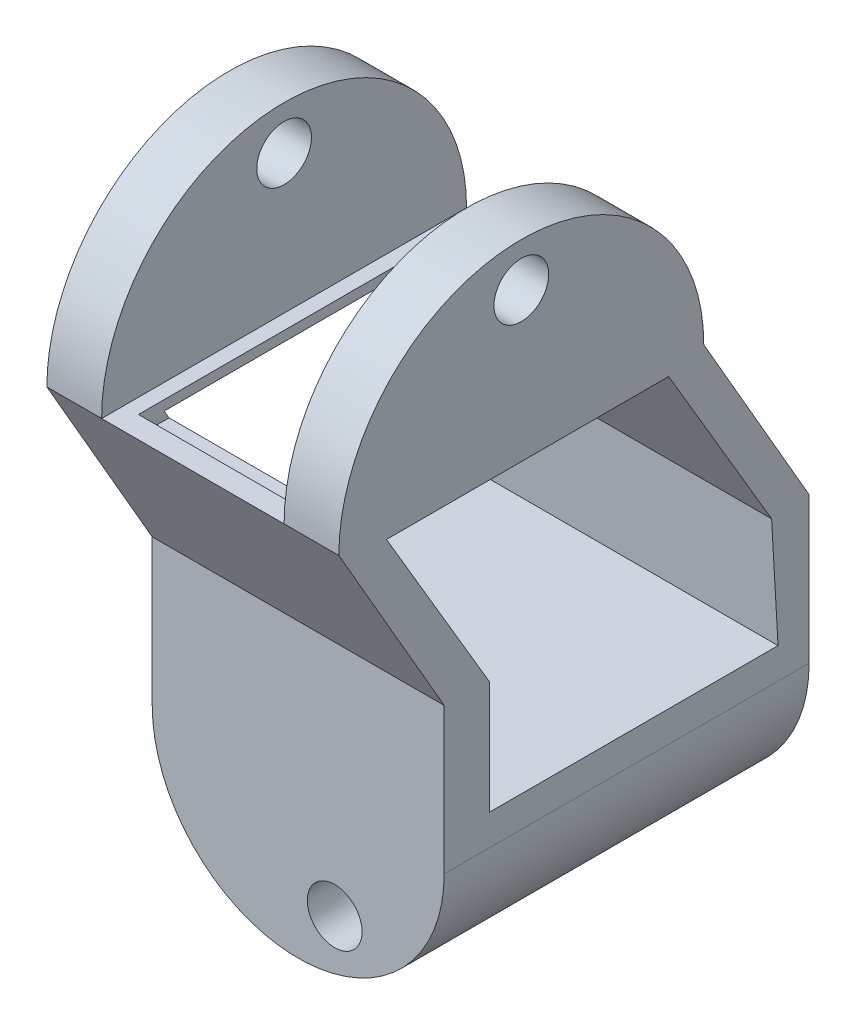
ISO-10303-21;
HEADER;
FILE_DESCRIPTION(('STEP AP214'),'2;1');
FILE_NAME('part.step','',(''),(''),'','','');
FILE_SCHEMA(('AUTOMOTIVE_DESIGN { 1 0 10303 214 1 1 1 1 }'));
ENDSEC;
DATA;
#1=APPLICATION_CONTEXT('core data for automotive mechanical design processes');
#2=APPLICATION_PROTOCOL_DEFINITION('international standard','automotive_design',2000,#1);
#3=PRODUCT_CONTEXT('',#1,'mechanical');
#4=PRODUCT('Part','Part','',(#3));
#5=PRODUCT_RELATED_PRODUCT_CATEGORY('part','',(#4));
#6=PRODUCT_DEFINITION_FORMATION('','',#4);
#7=PRODUCT_DEFINITION_CONTEXT('part definition',#1,'design');
#8=PRODUCT_DEFINITION('design','',#6,#7);
#9=PRODUCT_DEFINITION_SHAPE('','',#8);
#10=(LENGTH_UNIT() NAMED_UNIT(*) SI_UNIT(.MILLI.,.METRE.));
#11=(NAMED_UNIT(*) PLANE_ANGLE_UNIT() SI_UNIT($,.RADIAN.));
#12=(NAMED_UNIT(*) SI_UNIT($,.STERADIAN.) SOLID_ANGLE_UNIT());
#13=UNCERTAINTY_MEASURE_WITH_UNIT(LENGTH_MEASURE(1.E-05),#10,'distance_accuracy_value','');
#14=(GEOMETRIC_REPRESENTATION_CONTEXT(3) GLOBAL_UNCERTAINTY_ASSIGNED_CONTEXT((#13)) GLOBAL_UNIT_ASSIGNED_CONTEXT((#10,
#11,#12)) REPRESENTATION_CONTEXT('',''));
#15=CARTESIAN_POINT('',(0.,0.,0.));
#16=DIRECTION('',(0.,0.,1.));
#17=DIRECTION('',(1.,0.,0.));
#18=AXIS2_PLACEMENT_3D('',#15,#16,#17);
#19=CARTESIAN_POINT('',(9.,12.727504909272,-6.77457000390734));
#20=DIRECTION('',(0.,-1.,0.));
#21=DIRECTION('',(0.,0.,-1.));
#22=AXIS2_PLACEMENT_3D('',#19,#20,#21);
#23=PLANE('',#22);
#24=DIRECTION('',(0.,0.,-1.));
#25=VECTOR('',#24,1.);
#26=CARTESIAN_POINT('',(1.90836720977318,12.727504909272,-6.77457000390734));
#27=LINE('',#26,#25);
#28=CARTESIAN_POINT('',(1.90836720977318,12.727504909272,-6.77457000390734));
#29=VERTEX_POINT('',#28);
#30=CARTESIAN_POINT('',(1.90836720977318,12.727504909272,-14.5066241062485));
#31=VERTEX_POINT('',#30);
#32=EDGE_CURVE('E227',#29,#31,#27,.T.);
#33=ORIENTED_EDGE('',*,*,#32,.F.);
#34=DIRECTION('',(-1.,0.,0.));
#35=VECTOR('',#34,1.);
#36=CARTESIAN_POINT('',(9.,12.727504909272,-6.77457000390734));
#37=LINE('',#36,#35);
#38=CARTESIAN_POINT('',(0.,12.727504909272,-6.77457000390734));
#39=VERTEX_POINT('',#38);
#40=EDGE_CURVE('E256',#29,#39,#37,.T.);
#41=ORIENTED_EDGE('',*,*,#40,.T.);
#42=DIRECTION('',(0.,0.,1.));
#43=VECTOR('',#42,1.);
#44=CARTESIAN_POINT('',(0.,12.727504909272,-6.77457000390734));
#45=LINE('',#44,#43);
#46=CARTESIAN_POINT('',(0.,12.727504909272,-14.5066241062485));
#47=VERTEX_POINT('',#46);
#48=EDGE_CURVE('E237',#47,#39,#45,.T.);
#49=ORIENTED_EDGE('',*,*,#48,.F.);
#50=DIRECTION('',(-1.,0.,0.));
#51=VECTOR('',#50,1.);
#52=CARTESIAN_POINT('',(9.,12.727504909272,-14.5066241062485));
#53=LINE('',#52,#51);
#54=EDGE_CURVE('E260',#31,#47,#53,.T.);
#55=ORIENTED_EDGE('',*,*,#54,.F.);
#56=EDGE_LOOP('',(#33,#41,#49,#55));
#57=FACE_BOUND('',#56,.T.);
#58=ADVANCED_FACE('F33',(#57),#23,.T.);
#59=CARTESIAN_POINT('',(0.,0.,0.));
#60=DIRECTION('',(1.,0.,0.));
#61=DIRECTION('',(0.,0.,-1.));
#62=AXIS2_PLACEMENT_3D('',#59,#60,#61);
#63=PLANE('',#62);
#64=CARTESIAN_POINT('',(0.,16.8,-10.469106503173));
#65=DIRECTION('',(1.,0.,0.));
#66=DIRECTION('',(0.,0.,-1.));
#67=AXIS2_PLACEMENT_3D('',#64,#65,#66);
#68=CIRCLE('',#67,0.75);
#69=CARTESIAN_POINT('',(0.,16.8,-11.219106503173));
#70=VERTEX_POINT('',#69);
#71=EDGE_CURVE('E291',#70,#70,#68,.T.);
#72=ORIENTED_EDGE('',*,*,#71,.T.);
#73=EDGE_LOOP('',(#72));
#74=FACE_BOUND('',#73,.T.);
#75=DIRECTION('',(0.,1.,0.));
#76=VECTOR('',#75,1.);
#77=CARTESIAN_POINT('',(0.,6.,-18.3558578491211));
#78=LINE('',#77,#76);
#79=CARTESIAN_POINT('',(0.,4.,-18.3558578491211));
#80=VERTEX_POINT('',#79);
#81=CARTESIAN_POINT('',(0.,8.,-18.3558578491211));
#82=VERTEX_POINT('',#81);
#83=EDGE_CURVE('E286',#80,#82,#78,.T.);
#84=ORIENTED_EDGE('',*,*,#83,.F.);
#85=DIRECTION('',(0.,0.,-1.));
#86=VECTOR('',#85,1.);
#87=CARTESIAN_POINT('',(0.,4.,-13.3558578491211));
#88=LINE('',#87,#86);
#89=CARTESIAN_POINT('',(0.,4.,-8.35585784912109));
#90=VERTEX_POINT('',#89);
#91=EDGE_CURVE('E336',#90,#80,#88,.T.);
#92=ORIENTED_EDGE('',*,*,#91,.F.);
#93=DIRECTION('',(0.,-1.,0.));
#94=VECTOR('',#93,1.);
#95=CARTESIAN_POINT('',(0.,6.,-8.35585784912109));
#96=LINE('',#95,#94);
#97=CARTESIAN_POINT('',(0.,7.99999999999999,-8.35585784912109));
#98=VERTEX_POINT('',#97);
#99=EDGE_CURVE('E310',#98,#90,#96,.T.);
#100=ORIENTED_EDGE('',*,*,#99,.F.);
#101=DIRECTION('',(0.,-0.866025403784438,-0.5));
#102=VECTOR('',#101,1.);
#103=CARTESIAN_POINT('',(0.,10.5,-6.91248217614702));
#104=LINE('',#103,#102);
#105=CARTESIAN_POINT('',(0.,13.,-5.46910650317296));
#106=VERTEX_POINT('',#105);
#107=EDGE_CURVE('E307',#106,#98,#104,.T.);
#108=ORIENTED_EDGE('',*,*,#107,.F.);
#109=CARTESIAN_POINT('',(0.,13.,-10.469106503173));
#110=DIRECTION('',(1.,0.,0.));
#111=DIRECTION('',(0.,0.,1.));
#112=AXIS2_PLACEMENT_3D('',#109,#110,#111);
#113=CIRCLE('',#112,5.);
#114=CARTESIAN_POINT('',(0.,13.,-15.469106503173));
#115=VERTEX_POINT('',#114);
#116=EDGE_CURVE('E287',#115,#106,#113,.T.);
#117=ORIENTED_EDGE('',*,*,#116,.F.);
#118=DIRECTION('',(0.,0.866025403784438,0.5));
#119=VECTOR('',#118,1.);
#120=CARTESIAN_POINT('',(0.,10.5,-16.912482176147));
#121=LINE('',#120,#119);
#122=EDGE_CURVE('E284',#82,#115,#121,.T.);
#123=ORIENTED_EDGE('',*,*,#122,.F.);
#124=EDGE_LOOP('',(#84,#92,#100,#108,#117,#123));
#125=FACE_BOUND('',#124,.T.);
#126=DIRECTION('',(0.,0.99838451669071,0.0568186310311785));
#127=VECTOR('',#126,1.);
#128=CARTESIAN_POINT('',(0.,7.94219455277417,-17.327438632184));
#129=LINE('',#128,#127);
#130=CARTESIAN_POINT('',(0.,4.84433574304134,-17.5037395400549));
#131=VERTEX_POINT('',#130);
#132=CARTESIAN_POINT('',(0.,7.94219455277417,-17.327438632184));
#133=VERTEX_POINT('',#132);
#134=EDGE_CURVE('E231',#131,#133,#129,.T.);
#135=ORIENTED_EDGE('',*,*,#134,.T.);
#136=DIRECTION('',(0.,0.861467625545316,0.507812495058279));
#137=VECTOR('',#136,1.);
#138=CARTESIAN_POINT('',(0.,12.727504909272,-14.5066241062485));
#139=LINE('',#138,#137);
#140=EDGE_CURVE('E234',#133,#47,#139,.T.);
#141=ORIENTED_EDGE('',*,*,#140,.T.);
#142=ORIENTED_EDGE('',*,*,#48,.T.);
#143=DIRECTION('',(0.,-0.861467625545316,-0.507812495058279));
#144=VECTOR('',#143,1.);
#145=CARTESIAN_POINT('',(0.,7.94219455277417,-9.59538452984281));
#146=LINE('',#145,#144);
#147=CARTESIAN_POINT('',(0.,7.94219455277417,-9.59538452984281));
#148=VERTEX_POINT('',#147);
#149=EDGE_CURVE('E240',#39,#148,#146,.T.);
#150=ORIENTED_EDGE('',*,*,#149,.T.);
#151=DIRECTION('',(0.,-1.,0.));
#152=VECTOR('',#151,1.);
#153=CARTESIAN_POINT('',(0.,4.84433574304134,-9.59538452984281));
#154=LINE('',#153,#152);
#155=CARTESIAN_POINT('',(0.,4.84433574304134,-9.59538452984281));
#156=VERTEX_POINT('',#155);
#157=EDGE_CURVE('E243',#148,#156,#154,.T.);
#158=ORIENTED_EDGE('',*,*,#157,.T.);
#159=DIRECTION('',(0.,0.,-1.));
#160=VECTOR('',#159,1.);
#161=CARTESIAN_POINT('',(0.,4.84433574304134,-17.5037395400549));
#162=LINE('',#161,#160);
#163=EDGE_CURVE('E246',#156,#131,#162,.T.);
#164=ORIENTED_EDGE('',*,*,#163,.T.);
#165=EDGE_LOOP('',(#135,#141,#142,#150,#158,#164));
#166=FACE_BOUND('',#165,.T.);
#167=ADVANCED_FACE('F416',(#74,#125,#166),#63,.F.);
#168=CARTESIAN_POINT('',(8.,0.,0.));
#169=DIRECTION('',(1.,0.,0.));
#170=DIRECTION('',(0.,0.,-1.));
#171=AXIS2_PLACEMENT_3D('',#168,#169,#170);
#172=PLANE('',#171);
#173=DIRECTION('',(0.,0.,-1.));
#174=VECTOR('',#173,1.);
#175=CARTESIAN_POINT('',(8.,4.,-13.3558578491211));
#176=LINE('',#175,#174);
#177=CARTESIAN_POINT('',(8.,4.,-8.35585784912109));
#178=VERTEX_POINT('',#177);
#179=CARTESIAN_POINT('',(8.,4.,-18.3558578491211));
#180=VERTEX_POINT('',#179);
#181=EDGE_CURVE('E266',#178,#180,#176,.T.);
#182=ORIENTED_EDGE('',*,*,#181,.T.);
#183=DIRECTION('',(0.,1.,0.));
#184=VECTOR('',#183,1.);
#185=CARTESIAN_POINT('',(8.,6.,-18.3558578491211));
#186=LINE('',#185,#184);
#187=CARTESIAN_POINT('',(8.,8.,-18.3558578491211));
#188=VERTEX_POINT('',#187);
#189=EDGE_CURVE('E318',#180,#188,#186,.T.);
#190=ORIENTED_EDGE('',*,*,#189,.T.);
#191=DIRECTION('',(0.,0.866025403784438,0.5));
#192=VECTOR('',#191,1.);
#193=CARTESIAN_POINT('',(8.,10.5,-16.912482176147));
#194=LINE('',#193,#192);
#195=CARTESIAN_POINT('',(8.,13.,-15.469106503173));
#196=VERTEX_POINT('',#195);
#197=EDGE_CURVE('E267',#188,#196,#194,.T.);
#198=ORIENTED_EDGE('',*,*,#197,.T.);
#199=CARTESIAN_POINT('',(8.,13.,-10.469106503173));
#200=DIRECTION('',(-1.,0.,0.));
#201=DIRECTION('',(0.,0.,1.));
#202=AXIS2_PLACEMENT_3D('',#199,#200,#201);
#203=CIRCLE('',#202,5.);
#204=CARTESIAN_POINT('',(8.,13.,-5.46910650317296));
#205=VERTEX_POINT('',#204);
#206=EDGE_CURVE('E326',#205,#196,#203,.T.);
#207=ORIENTED_EDGE('',*,*,#206,.F.);
#208=DIRECTION('',(0.,-0.866025403784438,-0.5));
#209=VECTOR('',#208,1.);
#210=CARTESIAN_POINT('',(8.,10.5,-6.91248217614702));
#211=LINE('',#210,#209);
#212=CARTESIAN_POINT('',(8.,7.99999999999999,-8.35585784912109));
#213=VERTEX_POINT('',#212);
#214=EDGE_CURVE('E278',#205,#213,#211,.T.);
#215=ORIENTED_EDGE('',*,*,#214,.T.);
#216=DIRECTION('',(0.,-1.,0.));
#217=VECTOR('',#216,1.);
#218=CARTESIAN_POINT('',(8.,6.,-8.35585784912109));
#219=LINE('',#218,#217);
#220=EDGE_CURVE('E306',#213,#178,#219,.T.);
#221=ORIENTED_EDGE('',*,*,#220,.T.);
#222=EDGE_LOOP('',(#182,#190,#198,#207,#215,#221));
#223=FACE_BOUND('',#222,.T.);
#224=CARTESIAN_POINT('',(8.,16.8,-10.469106503173));
#225=DIRECTION('',(1.,0.,0.));
#226=DIRECTION('',(0.,0.,-1.));
#227=AXIS2_PLACEMENT_3D('',#224,#225,#226);
#228=CIRCLE('',#227,0.75);
#229=CARTESIAN_POINT('',(8.,16.8,-11.219106503173));
#230=VERTEX_POINT('',#229);
#231=EDGE_CURVE('E323',#230,#230,#228,.T.);
#232=ORIENTED_EDGE('',*,*,#231,.F.);
#233=EDGE_LOOP('',(#232));
#234=FACE_BOUND('',#233,.T.);
#235=DIRECTION('',(0.,-0.861467625545316,-0.507812495058279));
#236=VECTOR('',#235,1.);
#237=CARTESIAN_POINT('',(8.,9.6282127819025,-16.3335752550136));
#238=LINE('',#237,#236);
#239=CARTESIAN_POINT('',(8.,12.727504909272,-14.5066241062485));
#240=VERTEX_POINT('',#239);
#241=CARTESIAN_POINT('',(8.,7.94219455277417,-17.327438632184));
#242=VERTEX_POINT('',#241);
#243=EDGE_CURVE('E366',#240,#242,#238,.T.);
#244=ORIENTED_EDGE('',*,*,#243,.T.);
#245=DIRECTION('',(0.,-0.99838451669071,-0.0568186310311785));
#246=VECTOR('',#245,1.);
#247=CARTESIAN_POINT('',(8.,1.00857110260879,-17.7220350886974));
#248=LINE('',#247,#246);
#249=CARTESIAN_POINT('',(8.,4.84433574304134,-17.5037395400549));
#250=VERTEX_POINT('',#249);
#251=EDGE_CURVE('E369',#242,#250,#248,.T.);
#252=ORIENTED_EDGE('',*,*,#251,.T.);
#253=DIRECTION('',(0.,0.,1.));
#254=VECTOR('',#253,1.);
#255=CARTESIAN_POINT('',(8.,4.84433574304134,0.));
#256=LINE('',#255,#254);
#257=CARTESIAN_POINT('',(8.,4.84433574304134,-9.59538452984281));
#258=VERTEX_POINT('',#257);
#259=EDGE_CURVE('E270',#250,#258,#256,.T.);
#260=ORIENTED_EDGE('',*,*,#259,.T.);
#261=DIRECTION('',(0.,1.,0.));
#262=VECTOR('',#261,1.);
#263=CARTESIAN_POINT('',(8.,0.,-9.59538452984281));
#264=LINE('',#263,#262);
#265=CARTESIAN_POINT('',(8.,7.94219455277417,-9.59538452984281));
#266=VERTEX_POINT('',#265);
#267=EDGE_CURVE('E357',#258,#266,#264,.T.);
#268=ORIENTED_EDGE('',*,*,#267,.T.);
#269=DIRECTION('',(0.,0.861467625545316,0.507812495058279));
#270=VECTOR('',#269,1.);
#271=CARTESIAN_POINT('',(8.,6.24571727787698,-10.5954132392559));
#272=LINE('',#271,#270);
#273=CARTESIAN_POINT('',(8.,12.727504909272,-6.77457000390734));
#274=VERTEX_POINT('',#273);
#275=EDGE_CURVE('E360',#266,#274,#272,.T.);
#276=ORIENTED_EDGE('',*,*,#275,.T.);
#277=DIRECTION('',(0.,0.,-1.));
#278=VECTOR('',#277,1.);
#279=CARTESIAN_POINT('',(8.,12.727504909272,0.));
#280=LINE('',#279,#278);
#281=EDGE_CURVE('E363',#274,#240,#280,.T.);
#282=ORIENTED_EDGE('',*,*,#281,.T.);
#283=EDGE_LOOP('',(#244,#252,#260,#268,#276,#282));
#284=FACE_BOUND('',#283,.T.);
#285=ADVANCED_FACE('F408',(#223,#234,#284),#172,.T.);
#286=CARTESIAN_POINT('',(0.,8.,-18.3558578491211));
#287=DIRECTION('',(0.,0.5,-0.866025403784438));
#288=DIRECTION('',(0.,0.866025403784438,0.5));
#289=AXIS2_PLACEMENT_3D('',#286,#287,#288);
#290=PLANE('',#289);
#291=ORIENTED_EDGE('',*,*,#197,.F.);
#292=DIRECTION('',(1.,0.,0.));
#293=VECTOR('',#292,1.);
#294=CARTESIAN_POINT('',(4.,8.,-18.3558578491211));
#295=LINE('',#294,#293);
#296=EDGE_CURVE('E274',#82,#188,#295,.T.);
#297=ORIENTED_EDGE('',*,*,#296,.F.);
#298=ORIENTED_EDGE('',*,*,#122,.T.);
#299=DIRECTION('',(1.,0.,0.));
#300=VECTOR('',#299,1.);
#301=CARTESIAN_POINT('',(0.75,13.,-15.469106503173));
#302=LINE('',#301,#300);
#303=CARTESIAN_POINT('',(1.5,13.,-15.469106503173));
#304=VERTEX_POINT('',#303);
#305=EDGE_CURVE('E279',#115,#304,#302,.T.);
#306=ORIENTED_EDGE('',*,*,#305,.T.);
#307=DIRECTION('',(1.,0.,0.));
#308=VECTOR('',#307,1.);
#309=CARTESIAN_POINT('',(4.,13.,-15.469106503173));
#310=LINE('',#309,#308);
#311=CARTESIAN_POINT('',(6.5,13.,-15.469106503173));
#312=VERTEX_POINT('',#311);
#313=EDGE_CURVE('E275',#304,#312,#310,.T.);
#314=ORIENTED_EDGE('',*,*,#313,.T.);
#315=DIRECTION('',(-1.,0.,0.));
#316=VECTOR('',#315,1.);
#317=CARTESIAN_POINT('',(7.25,13.,-15.469106503173));
#318=LINE('',#317,#316);
#319=EDGE_CURVE('E271',#196,#312,#318,.T.);
#320=ORIENTED_EDGE('',*,*,#319,.F.);
#321=EDGE_LOOP('',(#291,#297,#298,#306,#314,#320));
#322=FACE_BOUND('',#321,.T.);
#323=ADVANCED_FACE('F450',(#322),#290,.T.);
#324=CARTESIAN_POINT('',(0.,13.,-5.46910650317296));
#325=DIRECTION('',(0.,-1.,0.));
#326=DIRECTION('',(0.,0.,-1.));
#327=AXIS2_PLACEMENT_3D('',#324,#325,#326);
#328=PLANE('',#327);
#329=DIRECTION('',(1.,0.,0.));
#330=VECTOR('',#329,1.);
#331=CARTESIAN_POINT('',(1.90836720977318,13.,-6.07033541723766));
#332=LINE('',#331,#330);
#333=CARTESIAN_POINT('',(1.90836720977318,13.,-6.07033541723766));
#334=VERTEX_POINT('',#333);
#335=CARTESIAN_POINT('',(5.92935093581267,13.,-6.07033541723766));
#336=VERTEX_POINT('',#335);
#337=EDGE_CURVE('E208',#334,#336,#332,.T.);
#338=ORIENTED_EDGE('',*,*,#337,.F.);
#339=DIRECTION('',(0.,0.,1.));
#340=VECTOR('',#339,1.);
#341=CARTESIAN_POINT('',(1.90836720977318,13.,-14.9597747757016));
#342=LINE('',#341,#340);
#343=CARTESIAN_POINT('',(1.90836720977318,13.,-14.9597747757016));
#344=VERTEX_POINT('',#343);
#345=EDGE_CURVE('E48',#344,#334,#342,.T.);
#346=ORIENTED_EDGE('',*,*,#345,.F.);
#347=DIRECTION('',(-1.,0.,0.));
#348=VECTOR('',#347,1.);
#349=CARTESIAN_POINT('',(1.90836720977318,13.,-14.9597747757016));
#350=LINE('',#349,#348);
#351=CARTESIAN_POINT('',(5.92935093581267,13.,-14.9597747757016));
#352=VERTEX_POINT('',#351);
#353=EDGE_CURVE('E189',#352,#344,#350,.T.);
#354=ORIENTED_EDGE('',*,*,#353,.F.);
#355=DIRECTION('',(0.,0.,-1.));
#356=VECTOR('',#355,1.);
#357=CARTESIAN_POINT('',(5.92935093581267,13.,-14.9597747757016));
#358=LINE('',#357,#356);
#359=EDGE_CURVE('E210',#336,#352,#358,.T.);
#360=ORIENTED_EDGE('',*,*,#359,.F.);
#361=EDGE_LOOP('',(#338,#346,#354,#360));
#362=FACE_BOUND('',#361,.T.);
#363=ORIENTED_EDGE('',*,*,#313,.F.);
#364=DIRECTION('',(0.,0.,1.));
#365=VECTOR('',#364,1.);
#366=CARTESIAN_POINT('',(1.5,13.,-10.469106503173));
#367=LINE('',#366,#365);
#368=CARTESIAN_POINT('',(1.5,13.,-5.46910650317296));
#369=VERTEX_POINT('',#368);
#370=EDGE_CURVE('E298',#304,#369,#367,.T.);
#371=ORIENTED_EDGE('',*,*,#370,.T.);
#372=DIRECTION('',(1.,0.,0.));
#373=VECTOR('',#372,1.);
#374=CARTESIAN_POINT('',(4.,13.,-5.46910650317296));
#375=LINE('',#374,#373);
#376=CARTESIAN_POINT('',(6.5,13.,-5.46910650317296));
#377=VERTEX_POINT('',#376);
#378=EDGE_CURVE('E293',#369,#377,#375,.T.);
#379=ORIENTED_EDGE('',*,*,#378,.T.);
#380=DIRECTION('',(0.,0.,-1.));
#381=VECTOR('',#380,1.);
#382=CARTESIAN_POINT('',(6.5,13.,-10.469106503173));
#383=LINE('',#382,#381);
#384=EDGE_CURVE('E289',#377,#312,#383,.T.);
#385=ORIENTED_EDGE('',*,*,#384,.T.);
#386=EDGE_LOOP('',(#363,#371,#379,#385));
#387=FACE_BOUND('',#386,.T.);
#388=ADVANCED_FACE('F402',(#362,#387),#328,.F.);
#389=CARTESIAN_POINT('',(0.,7.99999999999999,-8.35585784912109));
#390=DIRECTION('',(0.,0.5,-0.866025403784438));
#391=DIRECTION('',(0.,0.866025403784439,0.5));
#392=AXIS2_PLACEMENT_3D('',#389,#390,#391);
#393=PLANE('',#392);
#394=ORIENTED_EDGE('',*,*,#214,.F.);
#395=DIRECTION('',(-1.,0.,0.));
#396=VECTOR('',#395,1.);
#397=CARTESIAN_POINT('',(7.25,13.,-5.46910650317295));
#398=LINE('',#397,#396);
#399=EDGE_CURVE('E282',#205,#377,#398,.T.);
#400=ORIENTED_EDGE('',*,*,#399,.T.);
#401=ORIENTED_EDGE('',*,*,#378,.F.);
#402=DIRECTION('',(1.,0.,0.));
#403=VECTOR('',#402,1.);
#404=CARTESIAN_POINT('',(0.75,13.,-5.46910650317295));
#405=LINE('',#404,#403);
#406=EDGE_CURVE('E296',#106,#369,#405,.T.);
#407=ORIENTED_EDGE('',*,*,#406,.F.);
#408=ORIENTED_EDGE('',*,*,#107,.T.);
#409=DIRECTION('',(1.,0.,0.));
#410=VECTOR('',#409,1.);
#411=CARTESIAN_POINT('',(4.,7.99999999999999,-8.35585784912109));
#412=LINE('',#411,#410);
#413=EDGE_CURVE('E303',#98,#213,#412,.T.);
#414=ORIENTED_EDGE('',*,*,#413,.T.);
#415=EDGE_LOOP('',(#394,#400,#401,#407,#408,#414));
#416=FACE_BOUND('',#415,.T.);
#417=ADVANCED_FACE('F456',(#416),#393,.F.);
#418=CARTESIAN_POINT('',(5.,1.5,-16.3558578491211));
#419=DIRECTION('',(0.,0.,1.));
#420=DIRECTION('',(1.,0.,0.));
#421=AXIS2_PLACEMENT_3D('',#418,#419,#420);
#422=CYLINDRICAL_SURFACE('',#421,0.75);
#423=CARTESIAN_POINT('',(5.,1.5,-18.3558578491211));
#424=DIRECTION('',(0.,0.,-1.));
#425=DIRECTION('',(1.,0.,0.));
#426=AXIS2_PLACEMENT_3D('',#423,#424,#425);
#427=CIRCLE('',#426,0.75);
#428=CARTESIAN_POINT('',(5.75,1.5,-18.3558578491211));
#429=VERTEX_POINT('',#428);
#430=EDGE_CURVE('E319',#429,#429,#427,.T.);
#431=ORIENTED_EDGE('',*,*,#430,.T.);
#432=EDGE_LOOP('',(#431));
#433=FACE_BOUND('',#432,.T.);
#434=CARTESIAN_POINT('',(5.,1.5,-8.35585784912109));
#435=DIRECTION('',(0.,0.,1.));
#436=DIRECTION('',(1.,0.,0.));
#437=AXIS2_PLACEMENT_3D('',#434,#435,#436);
#438=CIRCLE('',#437,0.75);
#439=CARTESIAN_POINT('',(5.75,1.5,-8.35585784912109));
#440=VERTEX_POINT('',#439);
#441=EDGE_CURVE('E315',#440,#440,#438,.T.);
#442=ORIENTED_EDGE('',*,*,#441,.T.);
#443=EDGE_LOOP('',(#442));
#444=FACE_BOUND('',#443,.T.);
#445=ADVANCED_FACE('F459',(#433,#444),#422,.F.);
#446=CARTESIAN_POINT('',(3.,16.8,-10.469106503173));
#447=DIRECTION('',(1.,0.,0.));
#448=DIRECTION('',(0.,0.,-1.));
#449=AXIS2_PLACEMENT_3D('',#446,#447,#448);
#450=CYLINDRICAL_SURFACE('',#449,0.75);
#451=CARTESIAN_POINT('',(6.5,16.8,-10.469106503173));
#452=DIRECTION('',(1.,0.,0.));
#453=DIRECTION('',(0.,0.,-1.));
#454=AXIS2_PLACEMENT_3D('',#451,#452,#453);
#455=CIRCLE('',#454,0.75);
#456=CARTESIAN_POINT('',(6.5,16.8,-11.219106503173));
#457=VERTEX_POINT('',#456);
#458=EDGE_CURVE('E297',#457,#457,#455,.T.);
#459=ORIENTED_EDGE('',*,*,#458,.F.);
#460=EDGE_LOOP('',(#459));
#461=FACE_BOUND('',#460,.T.);
#462=ORIENTED_EDGE('',*,*,#231,.T.);
#463=EDGE_LOOP('',(#462));
#464=FACE_BOUND('',#463,.T.);
#465=ADVANCED_FACE('F463',(#461,#464),#450,.F.);
#466=CARTESIAN_POINT('',(3.,16.8,-10.469106503173));
#467=DIRECTION('',(1.,0.,0.));
#468=DIRECTION('',(0.,0.,-1.));
#469=AXIS2_PLACEMENT_3D('',#466,#467,#468);
#470=CYLINDRICAL_SURFACE('',#469,0.75);
#471=ORIENTED_EDGE('',*,*,#71,.F.);
#472=EDGE_LOOP('',(#471));
#473=FACE_BOUND('',#472,.T.);
#474=CARTESIAN_POINT('',(1.5,16.8,-10.469106503173));
#475=DIRECTION('',(-1.,0.,0.));
#476=DIRECTION('',(0.,0.,-1.));
#477=AXIS2_PLACEMENT_3D('',#474,#475,#476);
#478=CIRCLE('',#477,0.75);
#479=CARTESIAN_POINT('',(1.5,16.8,-11.219106503173));
#480=VERTEX_POINT('',#479);
#481=EDGE_CURVE('E329',#480,#480,#478,.T.);
#482=ORIENTED_EDGE('',*,*,#481,.F.);
#483=EDGE_LOOP('',(#482));
#484=FACE_BOUND('',#483,.T.);
#485=ADVANCED_FACE('F467',(#473,#484),#470,.F.);
#486=CARTESIAN_POINT('',(7.25,13.,-10.469106503173));
#487=DIRECTION('',(-1.,0.,0.));
#488=DIRECTION('',(0.,0.,1.));
#489=AXIS2_PLACEMENT_3D('',#486,#487,#488);
#490=CYLINDRICAL_SURFACE('',#489,5.);
#491=ORIENTED_EDGE('',*,*,#319,.T.);
#492=CARTESIAN_POINT('',(6.5,13.,-10.469106503173));
#493=DIRECTION('',(1.,0.,0.));
#494=DIRECTION('',(0.,0.,1.));
#495=AXIS2_PLACEMENT_3D('',#492,#493,#494);
#496=CIRCLE('',#495,5.);
#497=EDGE_CURVE('E292',#312,#377,#496,.T.);
#498=ORIENTED_EDGE('',*,*,#497,.T.);
#499=ORIENTED_EDGE('',*,*,#399,.F.);
#500=ORIENTED_EDGE('',*,*,#206,.T.);
#501=EDGE_LOOP('',(#491,#498,#499,#500));
#502=FACE_BOUND('',#501,.T.);
#503=ADVANCED_FACE('F471',(#502),#490,.T.);
#504=CARTESIAN_POINT('',(6.5,0.,0.));
#505=DIRECTION('',(1.,0.,0.));
#506=DIRECTION('',(0.,0.,-1.));
#507=AXIS2_PLACEMENT_3D('',#504,#505,#506);
#508=PLANE('',#507);
#509=ORIENTED_EDGE('',*,*,#384,.F.);
#510=ORIENTED_EDGE('',*,*,#497,.F.);
#511=EDGE_LOOP('',(#509,#510));
#512=FACE_BOUND('',#511,.T.);
#513=ORIENTED_EDGE('',*,*,#458,.T.);
#514=EDGE_LOOP('',(#513));
#515=FACE_BOUND('',#514,.T.);
#516=ADVANCED_FACE('F475',(#512,#515),#508,.F.);
#517=CARTESIAN_POINT('',(0.75,13.,-10.469106503173));
#518=DIRECTION('',(-1.,0.,0.));
#519=DIRECTION('',(0.,0.,1.));
#520=AXIS2_PLACEMENT_3D('',#517,#518,#519);
#521=CYLINDRICAL_SURFACE('',#520,5.);
#522=CARTESIAN_POINT('',(1.5,13.,-10.469106503173));
#523=DIRECTION('',(-1.,0.,0.));
#524=DIRECTION('',(0.,0.,1.));
#525=AXIS2_PLACEMENT_3D('',#522,#523,#524);
#526=CIRCLE('',#525,5.);
#527=EDGE_CURVE('E283',#369,#304,#526,.T.);
#528=ORIENTED_EDGE('',*,*,#527,.T.);
#529=ORIENTED_EDGE('',*,*,#305,.F.);
#530=ORIENTED_EDGE('',*,*,#116,.T.);
#531=ORIENTED_EDGE('',*,*,#406,.T.);
#532=EDGE_LOOP('',(#528,#529,#530,#531));
#533=FACE_BOUND('',#532,.T.);
#534=ADVANCED_FACE('F479',(#533),#521,.T.);
#535=CARTESIAN_POINT('',(1.5,0.,0.));
#536=DIRECTION('',(-1.,0.,0.));
#537=DIRECTION('',(0.,0.,1.));
#538=AXIS2_PLACEMENT_3D('',#535,#536,#537);
#539=PLANE('',#538);
#540=ORIENTED_EDGE('',*,*,#527,.F.);
#541=ORIENTED_EDGE('',*,*,#370,.F.);
#542=EDGE_LOOP('',(#540,#541));
#543=FACE_BOUND('',#542,.T.);
#544=ORIENTED_EDGE('',*,*,#481,.T.);
#545=EDGE_LOOP('',(#544));
#546=FACE_BOUND('',#545,.T.);
#547=ADVANCED_FACE('F483',(#543,#546),#539,.F.);
#548=CARTESIAN_POINT('',(4.,4.,-11.912482176147));
#549=DIRECTION('',(0.,0.,-1.));
#550=DIRECTION('',(-1.,0.,0.));
#551=AXIS2_PLACEMENT_3D('',#548,#549,#550);
#552=CYLINDRICAL_SURFACE('',#551,4.);
#553=ORIENTED_EDGE('',*,*,#91,.T.);
#554=CARTESIAN_POINT('',(4.,4.,-18.3558578491211));
#555=DIRECTION('',(0.,0.,1.));
#556=DIRECTION('',(-1.,0.,0.));
#557=AXIS2_PLACEMENT_3D('',#554,#555,#556);
#558=CIRCLE('',#557,4.);
#559=EDGE_CURVE('E322',#80,#180,#558,.T.);
#560=ORIENTED_EDGE('',*,*,#559,.T.);
#561=ORIENTED_EDGE('',*,*,#181,.F.);
#562=CARTESIAN_POINT('',(4.,4.,-8.35585784912109));
#563=DIRECTION('',(0.,0.,-1.));
#564=DIRECTION('',(-1.,0.,0.));
#565=AXIS2_PLACEMENT_3D('',#562,#563,#564);
#566=CIRCLE('',#565,4.);
#567=EDGE_CURVE('E305',#178,#90,#566,.T.);
#568=ORIENTED_EDGE('',*,*,#567,.T.);
#569=EDGE_LOOP('',(#553,#560,#561,#568));
#570=FACE_BOUND('',#569,.T.);
#571=ADVANCED_FACE('F486',(#570),#552,.T.);
#572=CARTESIAN_POINT('',(0.,0.,-8.35585784912109));
#573=DIRECTION('',(0.,0.,-1.));
#574=DIRECTION('',(-1.,0.,0.));
#575=AXIS2_PLACEMENT_3D('',#572,#573,#574);
#576=PLANE('',#575);
#577=ORIENTED_EDGE('',*,*,#567,.F.);
#578=ORIENTED_EDGE('',*,*,#220,.F.);
#579=ORIENTED_EDGE('',*,*,#413,.F.);
#580=ORIENTED_EDGE('',*,*,#99,.T.);
#581=EDGE_LOOP('',(#577,#578,#579,#580));
#582=FACE_BOUND('',#581,.T.);
#583=ORIENTED_EDGE('',*,*,#441,.F.);
#584=EDGE_LOOP('',(#583));
#585=FACE_BOUND('',#584,.T.);
#586=ADVANCED_FACE('F491',(#582,#585),#576,.F.);
#587=CARTESIAN_POINT('',(0.,0.,-18.3558578491211));
#588=DIRECTION('',(0.,0.,-1.));
#589=DIRECTION('',(-1.,0.,0.));
#590=AXIS2_PLACEMENT_3D('',#587,#588,#589);
#591=PLANE('',#590);
#592=ORIENTED_EDGE('',*,*,#559,.F.);
#593=ORIENTED_EDGE('',*,*,#83,.T.);
#594=ORIENTED_EDGE('',*,*,#296,.T.);
#595=ORIENTED_EDGE('',*,*,#189,.F.);
#596=EDGE_LOOP('',(#592,#593,#594,#595));
#597=FACE_BOUND('',#596,.T.);
#598=ORIENTED_EDGE('',*,*,#430,.F.);
#599=EDGE_LOOP('',(#598));
#600=FACE_BOUND('',#599,.T.);
#601=ADVANCED_FACE('F35',(#597,#600),#591,.T.);
#602=CARTESIAN_POINT('',(9.,7.94219455277417,-17.327438632184));
#603=DIRECTION('',(0.,-0.0568186310311785,0.99838451669071));
#604=DIRECTION('',(0.,-0.99838451669071,-0.0568186310311785));
#605=AXIS2_PLACEMENT_3D('',#602,#603,#604);
#606=PLANE('',#605);
#607=DIRECTION('',(-1.,0.,0.));
#608=VECTOR('',#607,1.);
#609=CARTESIAN_POINT('',(9.,7.94219455277417,-17.327438632184));
#610=LINE('',#609,#608);
#611=EDGE_CURVE('E264',#242,#133,#610,.T.);
#612=ORIENTED_EDGE('',*,*,#611,.T.);
#613=ORIENTED_EDGE('',*,*,#134,.F.);
#614=DIRECTION('',(-1.,0.,0.));
#615=VECTOR('',#614,1.);
#616=CARTESIAN_POINT('',(9.,4.84433574304134,-17.5037395400549));
#617=LINE('',#616,#615);
#618=EDGE_CURVE('E249',#250,#131,#617,.T.);
#619=ORIENTED_EDGE('',*,*,#618,.F.);
#620=ORIENTED_EDGE('',*,*,#251,.F.);
#621=EDGE_LOOP('',(#612,#613,#619,#620));
#622=FACE_BOUND('',#621,.T.);
#623=ADVANCED_FACE('F419',(#622),#606,.T.);
#624=CARTESIAN_POINT('',(9.,12.727504909272,-14.5066241062485));
#625=DIRECTION('',(0.,-0.507812495058279,0.861467625545316));
#626=DIRECTION('',(0.,-0.861467625545316,-0.507812495058279));
#627=AXIS2_PLACEMENT_3D('',#624,#625,#626);
#628=PLANE('',#627);
#629=DIRECTION('',(0.,-0.861467625545316,-0.507812495058279));
#630=VECTOR('',#629,1.);
#631=CARTESIAN_POINT('',(1.90836720977318,12.727504909272,-14.5066241062485));
#632=LINE('',#631,#630);
#633=CARTESIAN_POINT('',(1.90836720977318,12.5,-14.640732263293));
#634=VERTEX_POINT('',#633);
#635=EDGE_CURVE('E229',#31,#634,#632,.T.);
#636=ORIENTED_EDGE('',*,*,#635,.F.);
#637=ORIENTED_EDGE('',*,*,#54,.T.);
#638=ORIENTED_EDGE('',*,*,#140,.F.);
#639=ORIENTED_EDGE('',*,*,#611,.F.);
#640=ORIENTED_EDGE('',*,*,#243,.F.);
#641=CARTESIAN_POINT('',(5.92935093581267,12.727504909272,-14.5066241062485));
#642=VERTEX_POINT('',#641);
#643=EDGE_CURVE('E261',#240,#642,#53,.T.);
#644=ORIENTED_EDGE('',*,*,#643,.T.);
#645=DIRECTION('',(0.,0.861467625545316,0.507812495058279));
#646=VECTOR('',#645,1.);
#647=CARTESIAN_POINT('',(5.92935093581267,12.727504909272,-14.5066241062485));
#648=LINE('',#647,#646);
#649=CARTESIAN_POINT('',(5.92935093581267,12.5,-14.640732263293));
#650=VERTEX_POINT('',#649);
#651=EDGE_CURVE('E225',#650,#642,#648,.T.);
#652=ORIENTED_EDGE('',*,*,#651,.F.);
#653=DIRECTION('',(-1.,0.,0.));
#654=VECTOR('',#653,1.);
#655=CARTESIAN_POINT('',(9.,12.5,-14.640732263293));
#656=LINE('',#655,#654);
#657=EDGE_CURVE('E217',#650,#634,#656,.T.);
#658=ORIENTED_EDGE('',*,*,#657,.T.);
#659=EDGE_LOOP('',(#636,#637,#638,#639,#640,#644,#652,#658));
#660=FACE_BOUND('',#659,.T.);
#661=ADVANCED_FACE('F388',(#660),#628,.T.);
#662=DIRECTION('',(0.,0.,1.));
#663=VECTOR('',#662,1.);
#664=CARTESIAN_POINT('',(5.92935093581267,12.727504909272,-6.77457000390734));
#665=LINE('',#664,#663);
#666=CARTESIAN_POINT('',(5.92935093581267,12.727504909272,-6.77457000390734));
#667=VERTEX_POINT('',#666);
#668=EDGE_CURVE('E223',#642,#667,#665,.T.);
#669=ORIENTED_EDGE('',*,*,#668,.F.);
#670=ORIENTED_EDGE('',*,*,#643,.F.);
#671=ORIENTED_EDGE('',*,*,#281,.F.);
#672=EDGE_CURVE('E257',#274,#667,#37,.T.);
#673=ORIENTED_EDGE('',*,*,#672,.T.);
#674=EDGE_LOOP('',(#669,#670,#671,#673));
#675=FACE_BOUND('',#674,.T.);
#676=ADVANCED_FACE('F406',(#675),#23,.T.);
#677=CARTESIAN_POINT('',(9.,7.94219455277417,-9.59538452984281));
#678=DIRECTION('',(0.,0.507812495058279,-0.861467625545316));
#679=DIRECTION('',(0.,0.861467625545316,0.507812495058279));
#680=AXIS2_PLACEMENT_3D('',#677,#678,#679);
#681=PLANE('',#680);
#682=DIRECTION('',(0.,0.861467625545316,0.507812495058279));
#683=VECTOR('',#682,1.);
#684=CARTESIAN_POINT('',(1.90836720977318,7.94219455277417,-9.59538452984281));
#685=LINE('',#684,#683);
#686=CARTESIAN_POINT('',(1.90836720977318,12.5,-6.90867816095186));
#687=VERTEX_POINT('',#686);
#688=EDGE_CURVE('E11',#687,#29,#685,.T.);
#689=ORIENTED_EDGE('',*,*,#688,.F.);
#690=DIRECTION('',(1.,0.,0.));
#691=VECTOR('',#690,1.);
#692=CARTESIAN_POINT('',(9.,12.5,-6.90867816095186));
#693=LINE('',#692,#691);
#694=CARTESIAN_POINT('',(5.92935093581267,12.5,-6.90867816095186));
#695=VERTEX_POINT('',#694);
#696=EDGE_CURVE('E186',#687,#695,#693,.T.);
#697=ORIENTED_EDGE('',*,*,#696,.T.);
#698=DIRECTION('',(0.,-0.861467625545316,-0.507812495058279));
#699=VECTOR('',#698,1.);
#700=CARTESIAN_POINT('',(5.92935093581267,7.94219455277417,-9.59538452984281));
#701=LINE('',#700,#699);
#702=EDGE_CURVE('E41',#667,#695,#701,.T.);
#703=ORIENTED_EDGE('',*,*,#702,.F.);
#704=ORIENTED_EDGE('',*,*,#672,.F.);
#705=ORIENTED_EDGE('',*,*,#275,.F.);
#706=DIRECTION('',(-1.,0.,0.));
#707=VECTOR('',#706,1.);
#708=CARTESIAN_POINT('',(9.,7.94219455277417,-9.59538452984281));
#709=LINE('',#708,#707);
#710=EDGE_CURVE('E254',#266,#148,#709,.T.);
#711=ORIENTED_EDGE('',*,*,#710,.T.);
#712=ORIENTED_EDGE('',*,*,#149,.F.);
#713=ORIENTED_EDGE('',*,*,#40,.F.);
#714=EDGE_LOOP('',(#689,#697,#703,#704,#705,#711,#712,#713));
#715=FACE_BOUND('',#714,.T.);
#716=ADVANCED_FACE('F378',(#715),#681,.T.);
#717=CARTESIAN_POINT('',(9.,4.84433574304134,-9.59538452984281));
#718=DIRECTION('',(0.,0.,-1.));
#719=DIRECTION('',(-1.,0.,0.));
#720=AXIS2_PLACEMENT_3D('',#717,#718,#719);
#721=PLANE('',#720);
#722=DIRECTION('',(-1.,0.,0.));
#723=VECTOR('',#722,1.);
#724=CARTESIAN_POINT('',(9.,4.84433574304134,-9.59538452984281));
#725=LINE('',#724,#723);
#726=EDGE_CURVE('E252',#258,#156,#725,.T.);
#727=ORIENTED_EDGE('',*,*,#726,.T.);
#728=ORIENTED_EDGE('',*,*,#157,.F.);
#729=ORIENTED_EDGE('',*,*,#710,.F.);
#730=ORIENTED_EDGE('',*,*,#267,.F.);
#731=EDGE_LOOP('',(#727,#728,#729,#730));
#732=FACE_BOUND('',#731,.T.);
#733=ADVANCED_FACE('F413',(#732),#721,.T.);
#734=CARTESIAN_POINT('',(9.,4.84433574304134,-17.5037395400549));
#735=DIRECTION('',(0.,1.,0.));
#736=DIRECTION('',(0.,0.,1.));
#737=AXIS2_PLACEMENT_3D('',#734,#735,#736);
#738=PLANE('',#737);
#739=ORIENTED_EDGE('',*,*,#618,.T.);
#740=ORIENTED_EDGE('',*,*,#163,.F.);
#741=ORIENTED_EDGE('',*,*,#726,.F.);
#742=ORIENTED_EDGE('',*,*,#259,.F.);
#743=EDGE_LOOP('',(#739,#740,#741,#742));
#744=FACE_BOUND('',#743,.T.);
#745=ADVANCED_FACE('F421',(#744),#738,.T.);
#746=CARTESIAN_POINT('',(0.,12.5,0.));
#747=DIRECTION('',(0.,1.,0.));
#748=DIRECTION('',(0.,0.,1.));
#749=AXIS2_PLACEMENT_3D('',#746,#747,#748);
#750=PLANE('',#749);
#751=DIRECTION('',(0.,0.,-1.));
#752=VECTOR('',#751,1.);
#753=CARTESIAN_POINT('',(5.92935093581267,12.5,-14.9597747757016));
#754=LINE('',#753,#752);
#755=CARTESIAN_POINT('',(5.92935093581267,12.5,-14.9597747757016));
#756=VERTEX_POINT('',#755);
#757=EDGE_CURVE('E200',#650,#756,#754,.T.);
#758=ORIENTED_EDGE('',*,*,#757,.T.);
#759=DIRECTION('',(-1.,0.,0.));
#760=VECTOR('',#759,1.);
#761=CARTESIAN_POINT('',(1.90836720977318,12.5,-14.9597747757016));
#762=LINE('',#761,#760);
#763=CARTESIAN_POINT('',(1.90836720977318,12.5,-14.9597747757016));
#764=VERTEX_POINT('',#763);
#765=EDGE_CURVE('E197',#756,#764,#762,.T.);
#766=ORIENTED_EDGE('',*,*,#765,.T.);
#767=DIRECTION('',(0.,0.,1.));
#768=VECTOR('',#767,1.);
#769=CARTESIAN_POINT('',(1.90836720977318,12.5,-14.9597747757016));
#770=LINE('',#769,#768);
#771=EDGE_CURVE('E188',#764,#634,#770,.T.);
#772=ORIENTED_EDGE('',*,*,#771,.T.);
#773=ORIENTED_EDGE('',*,*,#657,.F.);
#774=EDGE_LOOP('',(#758,#766,#772,#773));
#775=FACE_BOUND('',#774,.T.);
#776=ADVANCED_FACE('F393',(#775),#750,.T.);
#777=CARTESIAN_POINT('',(1.90836720977318,12.5,-14.9597747757016));
#778=DIRECTION('',(-1.,0.,0.));
#779=DIRECTION('',(0.,0.,1.));
#780=AXIS2_PLACEMENT_3D('',#777,#778,#779);
#781=PLANE('',#780);
#782=ORIENTED_EDGE('',*,*,#635,.T.);
#783=ORIENTED_EDGE('',*,*,#771,.F.);
#784=DIRECTION('',(0.,1.,0.));
#785=VECTOR('',#784,1.);
#786=CARTESIAN_POINT('',(1.90836720977318,12.5,-14.9597747757016));
#787=LINE('',#786,#785);
#788=EDGE_CURVE('E215',#764,#344,#787,.T.);
#789=ORIENTED_EDGE('',*,*,#788,.T.);
#790=ORIENTED_EDGE('',*,*,#345,.T.);
#791=DIRECTION('',(0.,1.,0.));
#792=VECTOR('',#791,1.);
#793=CARTESIAN_POINT('',(1.90836720977318,12.5,-6.07033541723766));
#794=LINE('',#793,#792);
#795=CARTESIAN_POINT('',(1.90836720977318,12.5,-6.07033541723766));
#796=VERTEX_POINT('',#795);
#797=EDGE_CURVE('E191',#796,#334,#794,.T.);
#798=ORIENTED_EDGE('',*,*,#797,.F.);
#799=EDGE_CURVE('E181',#687,#796,#770,.T.);
#800=ORIENTED_EDGE('',*,*,#799,.F.);
#801=ORIENTED_EDGE('',*,*,#688,.T.);
#802=ORIENTED_EDGE('',*,*,#32,.T.);
#803=EDGE_LOOP('',(#782,#783,#789,#790,#798,#800,#801,#802));
#804=FACE_BOUND('',#803,.T.);
#805=ADVANCED_FACE('F192',(#804),#781,.F.);
#806=CARTESIAN_POINT('',(1.90836720977318,12.5,-14.9597747757016));
#807=DIRECTION('',(0.,0.,-1.));
#808=DIRECTION('',(-1.,0.,0.));
#809=AXIS2_PLACEMENT_3D('',#806,#807,#808);
#810=PLANE('',#809);
#811=ORIENTED_EDGE('',*,*,#353,.T.);
#812=ORIENTED_EDGE('',*,*,#788,.F.);
#813=ORIENTED_EDGE('',*,*,#765,.F.);
#814=DIRECTION('',(0.,1.,0.));
#815=VECTOR('',#814,1.);
#816=CARTESIAN_POINT('',(5.92935093581267,12.5,-14.9597747757016));
#817=LINE('',#816,#815);
#818=EDGE_CURVE('E218',#756,#352,#817,.T.);
#819=ORIENTED_EDGE('',*,*,#818,.T.);
#820=EDGE_LOOP('',(#811,#812,#813,#819));
#821=FACE_BOUND('',#820,.T.);
#822=ADVANCED_FACE('F398',(#821),#810,.F.);
#823=CARTESIAN_POINT('',(5.92935093581267,12.5,-14.9597747757016));
#824=DIRECTION('',(1.,0.,0.));
#825=DIRECTION('',(0.,0.,-1.));
#826=AXIS2_PLACEMENT_3D('',#823,#824,#825);
#827=PLANE('',#826);
#828=ORIENTED_EDGE('',*,*,#651,.T.);
#829=ORIENTED_EDGE('',*,*,#668,.T.);
#830=ORIENTED_EDGE('',*,*,#702,.T.);
#831=CARTESIAN_POINT('',(5.92935093581267,12.5,-6.07033541723766));
#832=VERTEX_POINT('',#831);
#833=EDGE_CURVE('E56',#832,#695,#754,.T.);
#834=ORIENTED_EDGE('',*,*,#833,.F.);
#835=DIRECTION('',(0.,1.,0.));
#836=VECTOR('',#835,1.);
#837=CARTESIAN_POINT('',(5.92935093581267,12.5,-6.07033541723766));
#838=LINE('',#837,#836);
#839=EDGE_CURVE('E196',#832,#336,#838,.T.);
#840=ORIENTED_EDGE('',*,*,#839,.T.);
#841=ORIENTED_EDGE('',*,*,#359,.T.);
#842=ORIENTED_EDGE('',*,*,#818,.F.);
#843=ORIENTED_EDGE('',*,*,#757,.F.);
#844=EDGE_LOOP('',(#828,#829,#830,#834,#840,#841,#842,#843));
#845=FACE_BOUND('',#844,.T.);
#846=ADVANCED_FACE('F374',(#845),#827,.F.);
#847=CARTESIAN_POINT('',(1.90836720977318,12.5,-6.07033541723766));
#848=DIRECTION('',(0.,0.,1.));
#849=DIRECTION('',(1.,0.,0.));
#850=AXIS2_PLACEMENT_3D('',#847,#848,#849);
#851=PLANE('',#850);
#852=ORIENTED_EDGE('',*,*,#337,.T.);
#853=ORIENTED_EDGE('',*,*,#839,.F.);
#854=DIRECTION('',(1.,0.,0.));
#855=VECTOR('',#854,1.);
#856=CARTESIAN_POINT('',(1.90836720977318,12.5,-6.07033541723766));
#857=LINE('',#856,#855);
#858=EDGE_CURVE('E184',#796,#832,#857,.T.);
#859=ORIENTED_EDGE('',*,*,#858,.F.);
#860=ORIENTED_EDGE('',*,*,#797,.T.);
#861=EDGE_LOOP('',(#852,#853,#859,#860));
#862=FACE_BOUND('',#861,.T.);
#863=ADVANCED_FACE('F199',(#862),#851,.F.);
#864=ORIENTED_EDGE('',*,*,#799,.T.);
#865=ORIENTED_EDGE('',*,*,#858,.T.);
#866=ORIENTED_EDGE('',*,*,#833,.T.);
#867=ORIENTED_EDGE('',*,*,#696,.F.);
#868=EDGE_LOOP('',(#864,#865,#866,#867));
#869=FACE_BOUND('',#868,.T.);
#870=ADVANCED_FACE('F182',(#869),#750,.T.);
#871=CLOSED_SHELL('',(#58,#167,#285,#323,#388,#417,#445,#465,#485,#503,#516,#534,#547,#571,#586,
#601,#623,#661,#676,#716,#733,#745,#776,#805,#822,#846,#863,#870));
#872=MANIFOLD_SOLID_BREP('B2',#871);
#873=ADVANCED_BREP_SHAPE_REPRESENTATION('',(#18,#872),#14);
#874=SHAPE_DEFINITION_REPRESENTATION(#9,#873);
ENDSEC;
END-ISO-10303-21;
